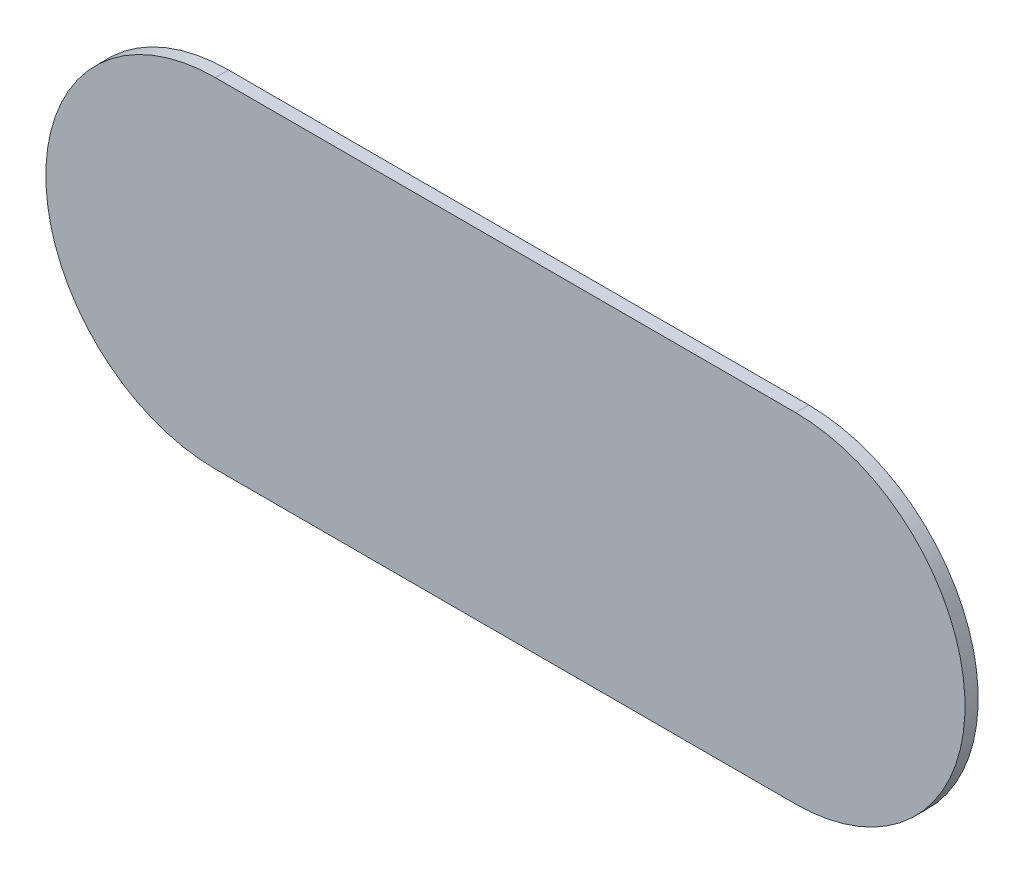
ISO-10303-21;
HEADER;
FILE_DESCRIPTION(('STEP AP214'),'2;1');
FILE_NAME('part.step','',(''),(''),'','','');
FILE_SCHEMA(('AUTOMOTIVE_DESIGN { 1 0 10303 214 1 1 1 1 }'));
ENDSEC;
DATA;
#1=APPLICATION_CONTEXT('core data for automotive mechanical design processes');
#2=APPLICATION_PROTOCOL_DEFINITION('international standard','automotive_design',2000,#1);
#3=PRODUCT_CONTEXT('',#1,'mechanical');
#4=PRODUCT('Part','Part','',(#3));
#5=PRODUCT_RELATED_PRODUCT_CATEGORY('part','',(#4));
#6=PRODUCT_DEFINITION_FORMATION('','',#4);
#7=PRODUCT_DEFINITION_CONTEXT('part definition',#1,'design');
#8=PRODUCT_DEFINITION('design','',#6,#7);
#9=PRODUCT_DEFINITION_SHAPE('','',#8);
#10=(LENGTH_UNIT() NAMED_UNIT(*) SI_UNIT(.MILLI.,.METRE.));
#11=(NAMED_UNIT(*) PLANE_ANGLE_UNIT() SI_UNIT($,.RADIAN.));
#12=(NAMED_UNIT(*) SI_UNIT($,.STERADIAN.) SOLID_ANGLE_UNIT());
#13=UNCERTAINTY_MEASURE_WITH_UNIT(LENGTH_MEASURE(1.E-05),#10,'distance_accuracy_value','');
#14=(GEOMETRIC_REPRESENTATION_CONTEXT(3) GLOBAL_UNCERTAINTY_ASSIGNED_CONTEXT((#13)) GLOBAL_UNIT_ASSIGNED_CONTEXT((#10,
#11,#12)) REPRESENTATION_CONTEXT('',''));
#15=CARTESIAN_POINT('',(0.,0.,0.));
#16=DIRECTION('',(0.,0.,1.));
#17=DIRECTION('',(1.,0.,0.));
#18=AXIS2_PLACEMENT_3D('',#15,#16,#17);
#19=CARTESIAN_POINT('',(135.03,-117.,1.635));
#20=DIRECTION('',(0.,0.,1.));
#21=DIRECTION('',(1.,0.,0.));
#22=AXIS2_PLACEMENT_3D('',#19,#20,#21);
#23=PLANE('',#22);
#24=DIRECTION('',(1.,0.,0.));
#25=VECTOR('',#24,1.);
#26=CARTESIAN_POINT('',(135.03,-117.,1.635));
#27=LINE('',#26,#25);
#28=CARTESIAN_POINT('',(135.03,-117.,1.635));
#29=VERTEX_POINT('',#28);
#30=CARTESIAN_POINT('',(136.57,-117.,1.635));
#31=VERTEX_POINT('',#30);
#32=EDGE_CURVE('E85',#29,#31,#27,.T.);
#33=ORIENTED_EDGE('',*,*,#32,.T.);
#34=CARTESIAN_POINT('',(136.57,-116.55,1.635));
#35=DIRECTION('',(0.,0.,1.));
#36=DIRECTION('',(0.,-1.,0.));
#37=AXIS2_PLACEMENT_3D('',#34,#35,#36);
#38=CIRCLE('',#37,0.45);
#39=CARTESIAN_POINT('',(136.57,-116.1,1.635));
#40=VERTEX_POINT('',#39);
#41=EDGE_CURVE('E71',#31,#40,#38,.T.);
#42=ORIENTED_EDGE('',*,*,#41,.T.);
#43=DIRECTION('',(-1.,0.,0.));
#44=VECTOR('',#43,1.);
#45=CARTESIAN_POINT('',(136.57,-116.1,1.635));
#46=LINE('',#45,#44);
#47=CARTESIAN_POINT('',(135.03,-116.1,1.635));
#48=VERTEX_POINT('',#47);
#49=EDGE_CURVE('E114',#40,#48,#46,.T.);
#50=ORIENTED_EDGE('',*,*,#49,.T.);
#51=CARTESIAN_POINT('',(135.03,-116.55,1.635));
#52=DIRECTION('',(0.,0.,1.));
#53=DIRECTION('',(0.,1.,0.));
#54=AXIS2_PLACEMENT_3D('',#51,#52,#53);
#55=CIRCLE('',#54,0.45);
#56=EDGE_CURVE('E11',#48,#29,#55,.T.);
#57=ORIENTED_EDGE('',*,*,#56,.T.);
#58=EDGE_LOOP('',(#33,#42,#50,#57));
#59=FACE_BOUND('',#58,.T.);
#60=ADVANCED_FACE('F17',(#59),#23,.T.);
#61=CARTESIAN_POINT('',(135.03,-117.,1.6));
#62=DIRECTION('',(0.,0.,1.));
#63=DIRECTION('',(1.,0.,0.));
#64=AXIS2_PLACEMENT_3D('',#61,#62,#63);
#65=PLANE('',#64);
#66=CARTESIAN_POINT('',(135.03,-116.55,1.6));
#67=DIRECTION('',(0.,0.,1.));
#68=DIRECTION('',(0.,1.,0.));
#69=AXIS2_PLACEMENT_3D('',#66,#67,#68);
#70=CIRCLE('',#69,0.45);
#71=CARTESIAN_POINT('',(135.03,-116.1,1.6));
#72=VERTEX_POINT('',#71);
#73=CARTESIAN_POINT('',(135.03,-117.,1.6));
#74=VERTEX_POINT('',#73);
#75=EDGE_CURVE('E21',#72,#74,#70,.T.);
#76=ORIENTED_EDGE('',*,*,#75,.F.);
#77=DIRECTION('',(-1.,0.,0.));
#78=VECTOR('',#77,1.);
#79=CARTESIAN_POINT('',(136.57,-116.1,1.6));
#80=LINE('',#79,#78);
#81=CARTESIAN_POINT('',(136.57,-116.1,1.6));
#82=VERTEX_POINT('',#81);
#83=EDGE_CURVE('E82',#82,#72,#80,.T.);
#84=ORIENTED_EDGE('',*,*,#83,.F.);
#85=CARTESIAN_POINT('',(136.57,-116.55,1.6));
#86=DIRECTION('',(0.,0.,1.));
#87=DIRECTION('',(0.,-1.,0.));
#88=AXIS2_PLACEMENT_3D('',#85,#86,#87);
#89=CIRCLE('',#88,0.45);
#90=CARTESIAN_POINT('',(136.57,-117.,1.6));
#91=VERTEX_POINT('',#90);
#92=EDGE_CURVE('E103',#91,#82,#89,.T.);
#93=ORIENTED_EDGE('',*,*,#92,.F.);
#94=DIRECTION('',(1.,0.,0.));
#95=VECTOR('',#94,1.);
#96=CARTESIAN_POINT('',(135.03,-117.,1.6));
#97=LINE('',#96,#95);
#98=EDGE_CURVE('E92',#74,#91,#97,.T.);
#99=ORIENTED_EDGE('',*,*,#98,.F.);
#100=EDGE_LOOP('',(#76,#84,#93,#99));
#101=FACE_BOUND('',#100,.T.);
#102=ADVANCED_FACE('F19',(#101),#65,.F.);
#103=CARTESIAN_POINT('',(135.03,-116.55,1.6));
#104=DIRECTION('',(0.,0.,-1.));
#105=DIRECTION('',(0.,1.,0.));
#106=AXIS2_PLACEMENT_3D('',#103,#104,#105);
#107=CYLINDRICAL_SURFACE('',#106,0.45);
#108=ORIENTED_EDGE('',*,*,#75,.T.);
#109=DIRECTION('',(0.,0.,1.));
#110=VECTOR('',#109,1.);
#111=CARTESIAN_POINT('',(135.03,-117.,1.6));
#112=LINE('',#111,#110);
#113=EDGE_CURVE('E89',#74,#29,#112,.T.);
#114=ORIENTED_EDGE('',*,*,#113,.T.);
#115=ORIENTED_EDGE('',*,*,#56,.F.);
#116=DIRECTION('',(0.,0.,1.));
#117=VECTOR('',#116,1.);
#118=CARTESIAN_POINT('',(135.03,-116.1,1.6));
#119=LINE('',#118,#117);
#120=EDGE_CURVE('E111',#72,#48,#119,.T.);
#121=ORIENTED_EDGE('',*,*,#120,.F.);
#122=EDGE_LOOP('',(#108,#114,#115,#121));
#123=FACE_BOUND('',#122,.T.);
#124=ADVANCED_FACE('F121',(#123),#107,.T.);
#125=CARTESIAN_POINT('',(136.57,-116.1,1.6));
#126=DIRECTION('',(0.,-1.,0.));
#127=DIRECTION('',(0.,0.,-1.));
#128=AXIS2_PLACEMENT_3D('',#125,#126,#127);
#129=PLANE('',#128);
#130=ORIENTED_EDGE('',*,*,#83,.T.);
#131=ORIENTED_EDGE('',*,*,#120,.T.);
#132=ORIENTED_EDGE('',*,*,#49,.F.);
#133=DIRECTION('',(0.,0.,1.));
#134=VECTOR('',#133,1.);
#135=CARTESIAN_POINT('',(136.57,-116.1,1.6));
#136=LINE('',#135,#134);
#137=EDGE_CURVE('E79',#82,#40,#136,.T.);
#138=ORIENTED_EDGE('',*,*,#137,.F.);
#139=EDGE_LOOP('',(#130,#131,#132,#138));
#140=FACE_BOUND('',#139,.T.);
#141=ADVANCED_FACE('F123',(#140),#129,.F.);
#142=CARTESIAN_POINT('',(136.57,-116.55,1.6));
#143=DIRECTION('',(0.,0.,-1.));
#144=DIRECTION('',(0.,-1.,0.));
#145=AXIS2_PLACEMENT_3D('',#142,#143,#144);
#146=CYLINDRICAL_SURFACE('',#145,0.45);
#147=ORIENTED_EDGE('',*,*,#92,.T.);
#148=ORIENTED_EDGE('',*,*,#137,.T.);
#149=ORIENTED_EDGE('',*,*,#41,.F.);
#150=DIRECTION('',(0.,0.,1.));
#151=VECTOR('',#150,1.);
#152=CARTESIAN_POINT('',(136.57,-117.,1.6));
#153=LINE('',#152,#151);
#154=EDGE_CURVE('E76',#91,#31,#153,.T.);
#155=ORIENTED_EDGE('',*,*,#154,.F.);
#156=EDGE_LOOP('',(#147,#148,#149,#155));
#157=FACE_BOUND('',#156,.T.);
#158=ADVANCED_FACE('F74',(#157),#146,.T.);
#159=CARTESIAN_POINT('',(135.03,-117.,1.6));
#160=DIRECTION('',(0.,1.,0.));
#161=DIRECTION('',(1.,0.,0.));
#162=AXIS2_PLACEMENT_3D('',#159,#160,#161);
#163=PLANE('',#162);
#164=ORIENTED_EDGE('',*,*,#98,.T.);
#165=ORIENTED_EDGE('',*,*,#154,.T.);
#166=ORIENTED_EDGE('',*,*,#32,.F.);
#167=ORIENTED_EDGE('',*,*,#113,.F.);
#168=EDGE_LOOP('',(#164,#165,#166,#167));
#169=FACE_BOUND('',#168,.T.);
#170=ADVANCED_FACE('F91',(#169),#163,.F.);
#171=CLOSED_SHELL('',(#60,#102,#124,#141,#158,#170));
#172=MANIFOLD_SOLID_BREP('B1',#171);
#173=ADVANCED_BREP_SHAPE_REPRESENTATION('',(#18,#172),#14);
#174=SHAPE_DEFINITION_REPRESENTATION(#9,#173);
ENDSEC;
END-ISO-10303-21;
